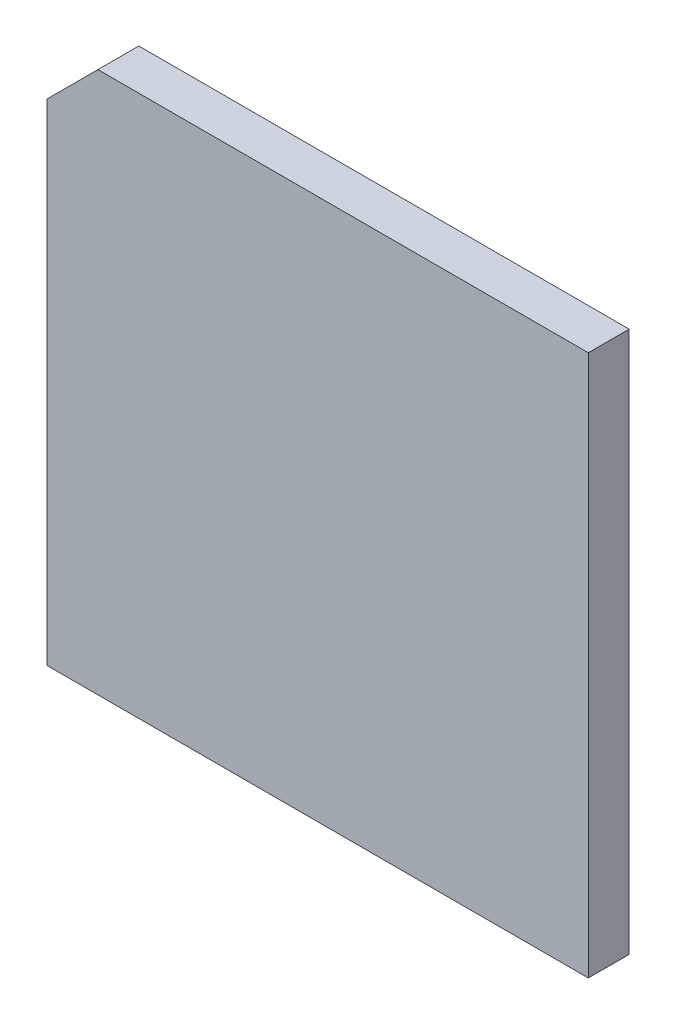
ISO-10303-21;
HEADER;
FILE_DESCRIPTION(('STEP AP214'),'2;1');
FILE_NAME('part.step','',(''),(''),'','','');
FILE_SCHEMA(('AUTOMOTIVE_DESIGN { 1 0 10303 214 1 1 1 1 }'));
ENDSEC;
DATA;
#1=APPLICATION_CONTEXT('core data for automotive mechanical design processes');
#2=APPLICATION_PROTOCOL_DEFINITION('international standard','automotive_design',2000,#1);
#3=PRODUCT_CONTEXT('',#1,'mechanical');
#4=PRODUCT('Part','Part','',(#3));
#5=PRODUCT_RELATED_PRODUCT_CATEGORY('part','',(#4));
#6=PRODUCT_DEFINITION_FORMATION('','',#4);
#7=PRODUCT_DEFINITION_CONTEXT('part definition',#1,'design');
#8=PRODUCT_DEFINITION('design','',#6,#7);
#9=PRODUCT_DEFINITION_SHAPE('','',#8);
#10=(LENGTH_UNIT() NAMED_UNIT(*) SI_UNIT(.MILLI.,.METRE.));
#11=(NAMED_UNIT(*) PLANE_ANGLE_UNIT() SI_UNIT($,.RADIAN.));
#12=(NAMED_UNIT(*) SI_UNIT($,.STERADIAN.) SOLID_ANGLE_UNIT());
#13=UNCERTAINTY_MEASURE_WITH_UNIT(LENGTH_MEASURE(1.E-05),#10,'distance_accuracy_value','');
#14=(GEOMETRIC_REPRESENTATION_CONTEXT(3) GLOBAL_UNCERTAINTY_ASSIGNED_CONTEXT((#13)) GLOBAL_UNIT_ASSIGNED_CONTEXT((#10,
#11,#12)) REPRESENTATION_CONTEXT('',''));
#15=CARTESIAN_POINT('',(0.,0.,0.));
#16=DIRECTION('',(0.,0.,1.));
#17=DIRECTION('',(1.,0.,0.));
#18=AXIS2_PLACEMENT_3D('',#15,#16,#17);
#19=CARTESIAN_POINT('',(0.,1.325,0.2));
#20=DIRECTION('',(0.,1.,0.));
#21=DIRECTION('',(1.,0.,0.));
#22=AXIS2_PLACEMENT_3D('',#19,#20,#21);
#23=PLANE('',#22);
#24=DIRECTION('',(1.,0.,0.));
#25=VECTOR('',#24,1.);
#26=CARTESIAN_POINT('',(0.,1.325,0.));
#27=LINE('',#26,#25);
#28=CARTESIAN_POINT('',(-1.075,1.325,0.));
#29=VERTEX_POINT('',#28);
#30=CARTESIAN_POINT('',(1.325,1.325,0.));
#31=VERTEX_POINT('',#30);
#32=EDGE_CURVE('E41',#29,#31,#27,.T.);
#33=ORIENTED_EDGE('',*,*,#32,.F.);
#34=DIRECTION('',(0.,0.,1.));
#35=VECTOR('',#34,1.);
#36=CARTESIAN_POINT('',(-1.075,1.325,0.2));
#37=LINE('',#36,#35);
#38=CARTESIAN_POINT('',(-1.075,1.325,0.2));
#39=VERTEX_POINT('',#38);
#40=EDGE_CURVE('E11',#29,#39,#37,.T.);
#41=ORIENTED_EDGE('',*,*,#40,.T.);
#42=DIRECTION('',(1.,0.,0.));
#43=VECTOR('',#42,1.);
#44=CARTESIAN_POINT('',(0.,1.325,0.2));
#45=LINE('',#44,#43);
#46=CARTESIAN_POINT('',(1.325,1.325,0.2));
#47=VERTEX_POINT('',#46);
#48=EDGE_CURVE('E28',#39,#47,#45,.T.);
#49=ORIENTED_EDGE('',*,*,#48,.T.);
#50=DIRECTION('',(0.,0.,-1.));
#51=VECTOR('',#50,1.);
#52=CARTESIAN_POINT('',(1.325,1.325,0.2));
#53=LINE('',#52,#51);
#54=EDGE_CURVE('E56',#47,#31,#53,.T.);
#55=ORIENTED_EDGE('',*,*,#54,.T.);
#56=EDGE_LOOP('',(#33,#41,#49,#55));
#57=FACE_BOUND('',#56,.T.);
#58=ADVANCED_FACE('F17',(#57),#23,.T.);
#59=CARTESIAN_POINT('',(-1.325,0.,0.2));
#60=DIRECTION('',(1.,0.,0.));
#61=DIRECTION('',(0.,1.,0.));
#62=AXIS2_PLACEMENT_3D('',#59,#60,#61);
#63=PLANE('',#62);
#64=DIRECTION('',(0.,-1.,0.));
#65=VECTOR('',#64,1.);
#66=CARTESIAN_POINT('',(-1.325,0.,0.2));
#67=LINE('',#66,#65);
#68=CARTESIAN_POINT('',(-1.325,1.075,0.2));
#69=VERTEX_POINT('',#68);
#70=CARTESIAN_POINT('',(-1.325,-1.325,0.2));
#71=VERTEX_POINT('',#70);
#72=EDGE_CURVE('E71',#69,#71,#67,.T.);
#73=ORIENTED_EDGE('',*,*,#72,.F.);
#74=DIRECTION('',(0.,0.,-1.));
#75=VECTOR('',#74,1.);
#76=CARTESIAN_POINT('',(-1.325,1.075,0.));
#77=LINE('',#76,#75);
#78=CARTESIAN_POINT('',(-1.325,1.075,0.));
#79=VERTEX_POINT('',#78);
#80=EDGE_CURVE('E133',#69,#79,#77,.T.);
#81=ORIENTED_EDGE('',*,*,#80,.T.);
#82=DIRECTION('',(0.,-1.,0.));
#83=VECTOR('',#82,1.);
#84=CARTESIAN_POINT('',(-1.325,0.,0.));
#85=LINE('',#84,#83);
#86=CARTESIAN_POINT('',(-1.325,-1.325,0.));
#87=VERTEX_POINT('',#86);
#88=EDGE_CURVE('E82',#79,#87,#85,.T.);
#89=ORIENTED_EDGE('',*,*,#88,.T.);
#90=DIRECTION('',(0.,0.,-1.));
#91=VECTOR('',#90,1.);
#92=CARTESIAN_POINT('',(-1.325,-1.325,0.2));
#93=LINE('',#92,#91);
#94=EDGE_CURVE('E21',#71,#87,#93,.T.);
#95=ORIENTED_EDGE('',*,*,#94,.F.);
#96=EDGE_LOOP('',(#73,#81,#89,#95));
#97=FACE_BOUND('',#96,.T.);
#98=ADVANCED_FACE('F19',(#97),#63,.F.);
#99=CARTESIAN_POINT('',(0.,-1.325,0.2));
#100=DIRECTION('',(0.,1.,0.));
#101=DIRECTION('',(1.,0.,0.));
#102=AXIS2_PLACEMENT_3D('',#99,#100,#101);
#103=PLANE('',#102);
#104=DIRECTION('',(1.,0.,0.));
#105=VECTOR('',#104,1.);
#106=CARTESIAN_POINT('',(0.,-1.325,0.));
#107=LINE('',#106,#105);
#108=CARTESIAN_POINT('',(1.325,-1.325,0.));
#109=VERTEX_POINT('',#108);
#110=EDGE_CURVE('E109',#87,#109,#107,.T.);
#111=ORIENTED_EDGE('',*,*,#110,.T.);
#112=DIRECTION('',(0.,0.,-1.));
#113=VECTOR('',#112,1.);
#114=CARTESIAN_POINT('',(1.325,-1.325,0.2));
#115=LINE('',#114,#113);
#116=CARTESIAN_POINT('',(1.325,-1.325,0.2));
#117=VERTEX_POINT('',#116);
#118=EDGE_CURVE('E107',#117,#109,#115,.T.);
#119=ORIENTED_EDGE('',*,*,#118,.F.);
#120=DIRECTION('',(1.,0.,0.));
#121=VECTOR('',#120,1.);
#122=CARTESIAN_POINT('',(0.,-1.325,0.2));
#123=LINE('',#122,#121);
#124=EDGE_CURVE('E97',#71,#117,#123,.T.);
#125=ORIENTED_EDGE('',*,*,#124,.F.);
#126=ORIENTED_EDGE('',*,*,#94,.T.);
#127=EDGE_LOOP('',(#111,#119,#125,#126));
#128=FACE_BOUND('',#127,.T.);
#129=ADVANCED_FACE('F108',(#128),#103,.F.);
#130=CARTESIAN_POINT('',(1.325,0.,0.2));
#131=DIRECTION('',(1.,0.,0.));
#132=DIRECTION('',(0.,1.,0.));
#133=AXIS2_PLACEMENT_3D('',#130,#131,#132);
#134=PLANE('',#133);
#135=DIRECTION('',(0.,-1.,0.));
#136=VECTOR('',#135,1.);
#137=CARTESIAN_POINT('',(1.325,0.,0.));
#138=LINE('',#137,#136);
#139=EDGE_CURVE('E122',#31,#109,#138,.T.);
#140=ORIENTED_EDGE('',*,*,#139,.F.);
#141=ORIENTED_EDGE('',*,*,#54,.F.);
#142=DIRECTION('',(0.,-1.,0.));
#143=VECTOR('',#142,1.);
#144=CARTESIAN_POINT('',(1.325,0.,0.2));
#145=LINE('',#144,#143);
#146=EDGE_CURVE('E100',#47,#117,#145,.T.);
#147=ORIENTED_EDGE('',*,*,#146,.T.);
#148=ORIENTED_EDGE('',*,*,#118,.T.);
#149=EDGE_LOOP('',(#140,#141,#147,#148));
#150=FACE_BOUND('',#149,.T.);
#151=ADVANCED_FACE('F113',(#150),#134,.T.);
#152=CARTESIAN_POINT('',(-0.3375,0.,0.2));
#153=DIRECTION('',(0.,0.,1.));
#154=DIRECTION('',(1.,0.,0.));
#155=AXIS2_PLACEMENT_3D('',#152,#153,#154);
#156=PLANE('',#155);
#157=ORIENTED_EDGE('',*,*,#48,.F.);
#158=DIRECTION('',(-0.707106781186548,-0.707106781186548,0.));
#159=VECTOR('',#158,1.);
#160=CARTESIAN_POINT('',(-1.36875,1.03125,0.2));
#161=LINE('',#160,#159);
#162=EDGE_CURVE('E111',#39,#69,#161,.T.);
#163=ORIENTED_EDGE('',*,*,#162,.T.);
#164=ORIENTED_EDGE('',*,*,#72,.T.);
#165=ORIENTED_EDGE('',*,*,#124,.T.);
#166=ORIENTED_EDGE('',*,*,#146,.F.);
#167=EDGE_LOOP('',(#157,#163,#164,#165,#166));
#168=FACE_BOUND('',#167,.T.);
#169=ADVANCED_FACE('F99',(#168),#156,.T.);
#170=CARTESIAN_POINT('',(-0.3375,0.,0.));
#171=DIRECTION('',(0.,0.,1.));
#172=DIRECTION('',(1.,0.,0.));
#173=AXIS2_PLACEMENT_3D('',#170,#171,#172);
#174=PLANE('',#173);
#175=ORIENTED_EDGE('',*,*,#88,.F.);
#176=DIRECTION('',(0.707106781186548,0.707106781186548,0.));
#177=VECTOR('',#176,1.);
#178=CARTESIAN_POINT('',(-1.325,1.075,0.));
#179=LINE('',#178,#177);
#180=EDGE_CURVE('E104',#79,#29,#179,.T.);
#181=ORIENTED_EDGE('',*,*,#180,.T.);
#182=ORIENTED_EDGE('',*,*,#32,.T.);
#183=ORIENTED_EDGE('',*,*,#139,.T.);
#184=ORIENTED_EDGE('',*,*,#110,.F.);
#185=EDGE_LOOP('',(#175,#181,#182,#183,#184));
#186=FACE_BOUND('',#185,.T.);
#187=ADVANCED_FACE('F129',(#186),#174,.F.);
#188=CARTESIAN_POINT('',(-1.325,1.075,0.2));
#189=DIRECTION('',(-0.707106781186548,0.707106781186548,0.));
#190=DIRECTION('',(0.,0.,1.));
#191=AXIS2_PLACEMENT_3D('',#188,#189,#190);
#192=PLANE('',#191);
#193=ORIENTED_EDGE('',*,*,#162,.F.);
#194=ORIENTED_EDGE('',*,*,#40,.F.);
#195=ORIENTED_EDGE('',*,*,#180,.F.);
#196=ORIENTED_EDGE('',*,*,#80,.F.);
#197=EDGE_LOOP('',(#193,#194,#195,#196));
#198=FACE_BOUND('',#197,.T.);
#199=ADVANCED_FACE('F132',(#198),#192,.T.);
#200=CLOSED_SHELL('',(#58,#98,#129,#151,#169,#187,#199));
#201=MANIFOLD_SOLID_BREP('B1',#200);
#202=ADVANCED_BREP_SHAPE_REPRESENTATION('',(#18,#201),#14);
#203=SHAPE_DEFINITION_REPRESENTATION(#9,#202);
ENDSEC;
END-ISO-10303-21;
